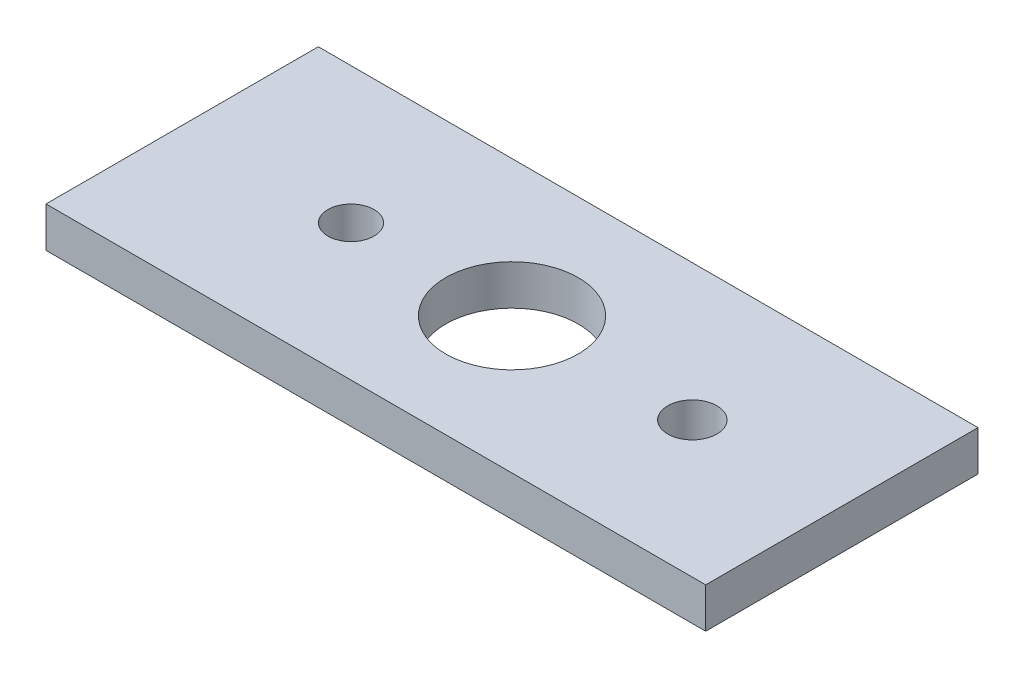
ISO-10303-21;
HEADER;
FILE_DESCRIPTION(('STEP AP214'),'2;1');
FILE_NAME('part.step','',(''),(''),'','','');
FILE_SCHEMA(('AUTOMOTIVE_DESIGN { 1 0 10303 214 1 1 1 1 }'));
ENDSEC;
DATA;
#1=APPLICATION_CONTEXT('core data for automotive mechanical design processes');
#2=APPLICATION_PROTOCOL_DEFINITION('international standard','automotive_design',2000,#1);
#3=PRODUCT_CONTEXT('',#1,'mechanical');
#4=PRODUCT('Part','Part','',(#3));
#5=PRODUCT_RELATED_PRODUCT_CATEGORY('part','',(#4));
#6=PRODUCT_DEFINITION_FORMATION('','',#4);
#7=PRODUCT_DEFINITION_CONTEXT('part definition',#1,'design');
#8=PRODUCT_DEFINITION('design','',#6,#7);
#9=PRODUCT_DEFINITION_SHAPE('','',#8);
#10=(LENGTH_UNIT() NAMED_UNIT(*) SI_UNIT(.MILLI.,.METRE.));
#11=(NAMED_UNIT(*) PLANE_ANGLE_UNIT() SI_UNIT($,.RADIAN.));
#12=(NAMED_UNIT(*) SI_UNIT($,.STERADIAN.) SOLID_ANGLE_UNIT());
#13=UNCERTAINTY_MEASURE_WITH_UNIT(LENGTH_MEASURE(1.E-05),#10,'distance_accuracy_value','');
#14=(GEOMETRIC_REPRESENTATION_CONTEXT(3) GLOBAL_UNCERTAINTY_ASSIGNED_CONTEXT((#13)) GLOBAL_UNIT_ASSIGNED_CONTEXT((#10,
#11,#12)) REPRESENTATION_CONTEXT('',''));
#15=CARTESIAN_POINT('',(0.,0.,0.));
#16=DIRECTION('',(0.,0.,1.));
#17=DIRECTION('',(1.,0.,0.));
#18=AXIS2_PLACEMENT_3D('',#15,#16,#17);
#19=CARTESIAN_POINT('',(-82.0281065906838,10.,33.858953655033));
#20=DIRECTION('',(1.,0.,0.));
#21=DIRECTION('',(0.,0.,-1.));
#22=AXIS2_PLACEMENT_3D('',#19,#20,#21);
#23=PLANE('',#22);
#24=DIRECTION('',(0.,0.,1.));
#25=VECTOR('',#24,1.);
#26=CARTESIAN_POINT('',(-82.0281065906838,0.,33.858953655033));
#27=LINE('',#26,#25);
#28=CARTESIAN_POINT('',(-82.0281065906838,0.,-33.858953655033));
#29=VERTEX_POINT('',#28);
#30=CARTESIAN_POINT('',(-82.0281065906838,0.,33.858953655033));
#31=VERTEX_POINT('',#30);
#32=EDGE_CURVE('E112',#29,#31,#27,.T.);
#33=ORIENTED_EDGE('',*,*,#32,.T.);
#34=DIRECTION('',(0.,-1.,0.));
#35=VECTOR('',#34,1.);
#36=CARTESIAN_POINT('',(-82.0281065906838,10.,33.858953655033));
#37=LINE('',#36,#35);
#38=CARTESIAN_POINT('',(-82.0281065906838,10.,33.858953655033));
#39=VERTEX_POINT('',#38);
#40=EDGE_CURVE('E11',#39,#31,#37,.T.);
#41=ORIENTED_EDGE('',*,*,#40,.F.);
#42=DIRECTION('',(0.,0.,1.));
#43=VECTOR('',#42,1.);
#44=CARTESIAN_POINT('',(-82.0281065906838,10.,33.858953655033));
#45=LINE('',#44,#43);
#46=CARTESIAN_POINT('',(-82.0281065906838,10.,-33.858953655033));
#47=VERTEX_POINT('',#46);
#48=EDGE_CURVE('E100',#47,#39,#45,.T.);
#49=ORIENTED_EDGE('',*,*,#48,.F.);
#50=DIRECTION('',(0.,-1.,0.));
#51=VECTOR('',#50,1.);
#52=CARTESIAN_POINT('',(-82.0281065906838,10.,-33.858953655033));
#53=LINE('',#52,#51);
#54=EDGE_CURVE('E108',#47,#29,#53,.T.);
#55=ORIENTED_EDGE('',*,*,#54,.T.);
#56=EDGE_LOOP('',(#33,#41,#49,#55));
#57=FACE_BOUND('',#56,.T.);
#58=ADVANCED_FACE('F49',(#57),#23,.F.);
#59=CARTESIAN_POINT('',(82.0281065906838,10.,33.858953655033));
#60=DIRECTION('',(0.,0.,-1.));
#61=DIRECTION('',(-1.,0.,0.));
#62=AXIS2_PLACEMENT_3D('',#59,#60,#61);
#63=PLANE('',#62);
#64=DIRECTION('',(1.,0.,0.));
#65=VECTOR('',#64,1.);
#66=CARTESIAN_POINT('',(82.0281065906838,0.,33.858953655033));
#67=LINE('',#66,#65);
#68=CARTESIAN_POINT('',(82.0281065906838,0.,33.858953655033));
#69=VERTEX_POINT('',#68);
#70=EDGE_CURVE('E104',#31,#69,#67,.T.);
#71=ORIENTED_EDGE('',*,*,#70,.T.);
#72=DIRECTION('',(0.,-1.,0.));
#73=VECTOR('',#72,1.);
#74=CARTESIAN_POINT('',(82.0281065906838,10.,33.858953655033));
#75=LINE('',#74,#73);
#76=CARTESIAN_POINT('',(82.0281065906838,10.,33.858953655033));
#77=VERTEX_POINT('',#76);
#78=EDGE_CURVE('E57',#77,#69,#75,.T.);
#79=ORIENTED_EDGE('',*,*,#78,.F.);
#80=DIRECTION('',(1.,0.,0.));
#81=VECTOR('',#80,1.);
#82=CARTESIAN_POINT('',(82.0281065906838,10.,33.858953655033));
#83=LINE('',#82,#81);
#84=EDGE_CURVE('E95',#39,#77,#83,.T.);
#85=ORIENTED_EDGE('',*,*,#84,.F.);
#86=ORIENTED_EDGE('',*,*,#40,.T.);
#87=EDGE_LOOP('',(#71,#79,#85,#86));
#88=FACE_BOUND('',#87,.T.);
#89=ADVANCED_FACE('F103',(#88),#63,.F.);
#90=CARTESIAN_POINT('',(82.0281065906838,10.,33.858953655033));
#91=DIRECTION('',(-1.,0.,0.));
#92=DIRECTION('',(0.,0.,1.));
#93=AXIS2_PLACEMENT_3D('',#90,#91,#92);
#94=PLANE('',#93);
#95=DIRECTION('',(0.,0.,-1.));
#96=VECTOR('',#95,1.);
#97=CARTESIAN_POINT('',(82.0281065906838,0.,33.858953655033));
#98=LINE('',#97,#96);
#99=CARTESIAN_POINT('',(82.0281065906838,0.,-33.858953655033));
#100=VERTEX_POINT('',#99);
#101=EDGE_CURVE('E82',#69,#100,#98,.T.);
#102=ORIENTED_EDGE('',*,*,#101,.T.);
#103=DIRECTION('',(0.,-1.,0.));
#104=VECTOR('',#103,1.);
#105=CARTESIAN_POINT('',(82.0281065906838,10.,-33.858953655033));
#106=LINE('',#105,#104);
#107=CARTESIAN_POINT('',(82.0281065906838,10.,-33.858953655033));
#108=VERTEX_POINT('',#107);
#109=EDGE_CURVE('E105',#108,#100,#106,.T.);
#110=ORIENTED_EDGE('',*,*,#109,.F.);
#111=DIRECTION('',(0.,0.,-1.));
#112=VECTOR('',#111,1.);
#113=CARTESIAN_POINT('',(82.0281065906838,10.,33.858953655033));
#114=LINE('',#113,#112);
#115=EDGE_CURVE('E98',#77,#108,#114,.T.);
#116=ORIENTED_EDGE('',*,*,#115,.F.);
#117=ORIENTED_EDGE('',*,*,#78,.T.);
#118=EDGE_LOOP('',(#102,#110,#116,#117));
#119=FACE_BOUND('',#118,.T.);
#120=ADVANCED_FACE('F106',(#119),#94,.F.);
#121=CARTESIAN_POINT('',(82.0281065906838,10.,-33.858953655033));
#122=DIRECTION('',(0.,0.,1.));
#123=DIRECTION('',(1.,0.,0.));
#124=AXIS2_PLACEMENT_3D('',#121,#122,#123);
#125=PLANE('',#124);
#126=DIRECTION('',(-1.,0.,0.));
#127=VECTOR('',#126,1.);
#128=CARTESIAN_POINT('',(82.0281065906838,0.,-33.858953655033));
#129=LINE('',#128,#127);
#130=EDGE_CURVE('E88',#100,#29,#129,.T.);
#131=ORIENTED_EDGE('',*,*,#130,.T.);
#132=ORIENTED_EDGE('',*,*,#54,.F.);
#133=DIRECTION('',(-1.,0.,0.));
#134=VECTOR('',#133,1.);
#135=CARTESIAN_POINT('',(82.0281065906838,10.,-33.858953655033));
#136=LINE('',#135,#134);
#137=EDGE_CURVE('E65',#108,#47,#136,.T.);
#138=ORIENTED_EDGE('',*,*,#137,.F.);
#139=ORIENTED_EDGE('',*,*,#109,.T.);
#140=EDGE_LOOP('',(#131,#132,#138,#139));
#141=FACE_BOUND('',#140,.T.);
#142=ADVANCED_FACE('F120',(#141),#125,.F.);
#143=CARTESIAN_POINT('',(0.,10.,0.));
#144=DIRECTION('',(0.,1.,0.));
#145=DIRECTION('',(0.,0.,1.));
#146=AXIS2_PLACEMENT_3D('',#143,#144,#145);
#147=PLANE('',#146);
#148=CARTESIAN_POINT('',(0.,10.,0.));
#149=DIRECTION('',(0.,1.,0.));
#150=DIRECTION('',(0.,0.,1.));
#151=AXIS2_PLACEMENT_3D('',#148,#149,#150);
#152=CIRCLE('',#151,16.472289058961);
#153=CARTESIAN_POINT('',(0.,10.,16.472289058961));
#154=VERTEX_POINT('',#153);
#155=EDGE_CURVE('E140',#154,#154,#152,.T.);
#156=ORIENTED_EDGE('',*,*,#155,.F.);
#157=EDGE_LOOP('',(#156));
#158=FACE_BOUND('',#157,.T.);
#159=CARTESIAN_POINT('',(44.8483096588729,10.,0.));
#160=DIRECTION('',(0.,1.,0.));
#161=DIRECTION('',(0.,0.,1.));
#162=AXIS2_PLACEMENT_3D('',#159,#160,#161);
#163=CIRCLE('',#162,6.10657787765905);
#164=CARTESIAN_POINT('',(44.8483096588729,10.,6.10657787765905));
#165=VERTEX_POINT('',#164);
#166=EDGE_CURVE('E133',#165,#165,#163,.T.);
#167=ORIENTED_EDGE('',*,*,#166,.F.);
#168=EDGE_LOOP('',(#167));
#169=FACE_BOUND('',#168,.T.);
#170=CARTESIAN_POINT('',(-40.0431336239936,10.,0.));
#171=DIRECTION('',(0.,1.,0.));
#172=DIRECTION('',(0.,0.,1.));
#173=AXIS2_PLACEMENT_3D('',#170,#171,#172);
#174=CIRCLE('',#173,5.73344867798093);
#175=CARTESIAN_POINT('',(-40.0431336239936,10.,5.73344867798093));
#176=VERTEX_POINT('',#175);
#177=EDGE_CURVE('E126',#176,#176,#174,.T.);
#178=ORIENTED_EDGE('',*,*,#177,.F.);
#179=EDGE_LOOP('',(#178));
#180=FACE_BOUND('',#179,.T.);
#181=ORIENTED_EDGE('',*,*,#48,.T.);
#182=ORIENTED_EDGE('',*,*,#84,.T.);
#183=ORIENTED_EDGE('',*,*,#115,.T.);
#184=ORIENTED_EDGE('',*,*,#137,.T.);
#185=EDGE_LOOP('',(#181,#182,#183,#184));
#186=FACE_BOUND('',#185,.T.);
#187=ADVANCED_FACE('F96',(#158,#169,#180,#186),#147,.T.);
#188=CARTESIAN_POINT('',(0.,0.,0.));
#189=DIRECTION('',(0.,1.,0.));
#190=DIRECTION('',(0.,0.,1.));
#191=AXIS2_PLACEMENT_3D('',#188,#189,#190);
#192=PLANE('',#191);
#193=CARTESIAN_POINT('',(0.,0.,0.));
#194=DIRECTION('',(0.,1.,0.));
#195=DIRECTION('',(0.,0.,1.));
#196=AXIS2_PLACEMENT_3D('',#193,#194,#195);
#197=CIRCLE('',#196,16.472289058961);
#198=CARTESIAN_POINT('',(0.,0.,16.472289058961));
#199=VERTEX_POINT('',#198);
#200=EDGE_CURVE('E137',#199,#199,#197,.T.);
#201=ORIENTED_EDGE('',*,*,#200,.T.);
#202=EDGE_LOOP('',(#201));
#203=FACE_BOUND('',#202,.T.);
#204=CARTESIAN_POINT('',(44.8483096588729,0.,0.));
#205=DIRECTION('',(0.,1.,0.));
#206=DIRECTION('',(0.,0.,1.));
#207=AXIS2_PLACEMENT_3D('',#204,#205,#206);
#208=CIRCLE('',#207,6.10657787765905);
#209=CARTESIAN_POINT('',(44.8483096588729,0.,6.10657787765905));
#210=VERTEX_POINT('',#209);
#211=EDGE_CURVE('E130',#210,#210,#208,.T.);
#212=ORIENTED_EDGE('',*,*,#211,.T.);
#213=EDGE_LOOP('',(#212));
#214=FACE_BOUND('',#213,.T.);
#215=CARTESIAN_POINT('',(-40.0431336239936,0.,0.));
#216=DIRECTION('',(0.,1.,0.));
#217=DIRECTION('',(0.,0.,1.));
#218=AXIS2_PLACEMENT_3D('',#215,#216,#217);
#219=CIRCLE('',#218,5.73344867798093);
#220=CARTESIAN_POINT('',(-40.0431336239936,0.,5.73344867798093));
#221=VERTEX_POINT('',#220);
#222=EDGE_CURVE('E115',#221,#221,#219,.T.);
#223=ORIENTED_EDGE('',*,*,#222,.T.);
#224=EDGE_LOOP('',(#223));
#225=FACE_BOUND('',#224,.T.);
#226=ORIENTED_EDGE('',*,*,#32,.F.);
#227=ORIENTED_EDGE('',*,*,#130,.F.);
#228=ORIENTED_EDGE('',*,*,#101,.F.);
#229=ORIENTED_EDGE('',*,*,#70,.F.);
#230=EDGE_LOOP('',(#226,#227,#228,#229));
#231=FACE_BOUND('',#230,.T.);
#232=ADVANCED_FACE('F123',(#203,#214,#225,#231),#192,.F.);
#233=CARTESIAN_POINT('',(-40.0431336239936,0.,0.));
#234=DIRECTION('',(0.,1.,0.));
#235=DIRECTION('',(0.,0.,1.));
#236=AXIS2_PLACEMENT_3D('',#233,#234,#235);
#237=CYLINDRICAL_SURFACE('',#236,5.73344867798093);
#238=ORIENTED_EDGE('',*,*,#222,.F.);
#239=EDGE_LOOP('',(#238));
#240=FACE_BOUND('',#239,.T.);
#241=ORIENTED_EDGE('',*,*,#177,.T.);
#242=EDGE_LOOP('',(#241));
#243=FACE_BOUND('',#242,.T.);
#244=ADVANCED_FACE('F163',(#240,#243),#237,.F.);
#245=CARTESIAN_POINT('',(44.8483096588729,0.,0.));
#246=DIRECTION('',(0.,1.,0.));
#247=DIRECTION('',(0.,0.,1.));
#248=AXIS2_PLACEMENT_3D('',#245,#246,#247);
#249=CYLINDRICAL_SURFACE('',#248,6.10657787765905);
#250=ORIENTED_EDGE('',*,*,#211,.F.);
#251=EDGE_LOOP('',(#250));
#252=FACE_BOUND('',#251,.T.);
#253=ORIENTED_EDGE('',*,*,#166,.T.);
#254=EDGE_LOOP('',(#253));
#255=FACE_BOUND('',#254,.T.);
#256=ADVANCED_FACE('F152',(#252,#255),#249,.F.);
#257=CARTESIAN_POINT('',(0.,0.,0.));
#258=DIRECTION('',(0.,1.,0.));
#259=DIRECTION('',(0.,0.,1.));
#260=AXIS2_PLACEMENT_3D('',#257,#258,#259);
#261=CYLINDRICAL_SURFACE('',#260,16.472289058961);
#262=ORIENTED_EDGE('',*,*,#200,.F.);
#263=EDGE_LOOP('',(#262));
#264=FACE_BOUND('',#263,.T.);
#265=ORIENTED_EDGE('',*,*,#155,.T.);
#266=EDGE_LOOP('',(#265));
#267=FACE_BOUND('',#266,.T.);
#268=ADVANCED_FACE('F149',(#264,#267),#261,.F.);
#269=CLOSED_SHELL('',(#58,#89,#120,#142,#187,#232,#244,#256,#268));
#270=MANIFOLD_SOLID_BREP('B2',#269);
#271=ADVANCED_BREP_SHAPE_REPRESENTATION('',(#18,#270),#14);
#272=SHAPE_DEFINITION_REPRESENTATION(#9,#271);
ENDSEC;
END-ISO-10303-21;
